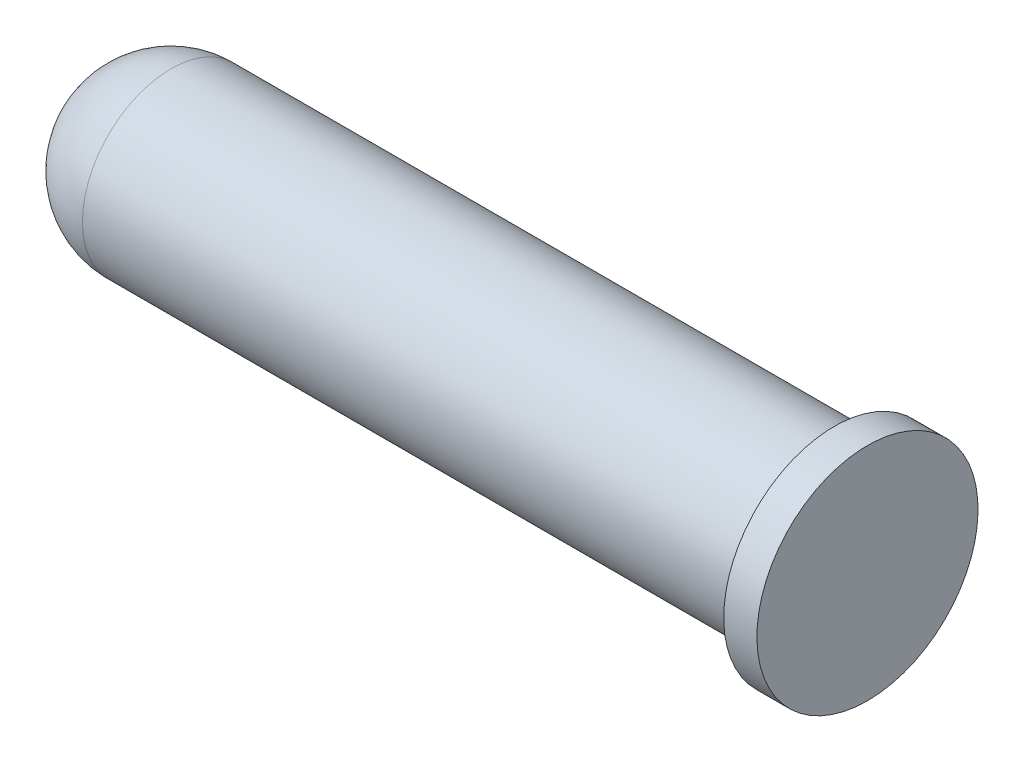
ISO-10303-21;
HEADER;
FILE_DESCRIPTION(('STEP AP214'),'2;1');
FILE_NAME('part.step','',(''),(''),'','','');
FILE_SCHEMA(('AUTOMOTIVE_DESIGN { 1 0 10303 214 1 1 1 1 }'));
ENDSEC;
DATA;
#1=APPLICATION_CONTEXT('core data for automotive mechanical design processes');
#2=APPLICATION_PROTOCOL_DEFINITION('international standard','automotive_design',2000,#1);
#3=PRODUCT_CONTEXT('',#1,'mechanical');
#4=PRODUCT('Part','Part','',(#3));
#5=PRODUCT_RELATED_PRODUCT_CATEGORY('part','',(#4));
#6=PRODUCT_DEFINITION_FORMATION('','',#4);
#7=PRODUCT_DEFINITION_CONTEXT('part definition',#1,'design');
#8=PRODUCT_DEFINITION('design','',#6,#7);
#9=PRODUCT_DEFINITION_SHAPE('','',#8);
#10=(LENGTH_UNIT() NAMED_UNIT(*) SI_UNIT(.MILLI.,.METRE.));
#11=(NAMED_UNIT(*) PLANE_ANGLE_UNIT() SI_UNIT($,.RADIAN.));
#12=(NAMED_UNIT(*) SI_UNIT($,.STERADIAN.) SOLID_ANGLE_UNIT());
#13=UNCERTAINTY_MEASURE_WITH_UNIT(LENGTH_MEASURE(1.E-05),#10,'distance_accuracy_value','');
#14=(GEOMETRIC_REPRESENTATION_CONTEXT(3) GLOBAL_UNCERTAINTY_ASSIGNED_CONTEXT((#13)) GLOBAL_UNIT_ASSIGNED_CONTEXT((#10,
#11,#12)) REPRESENTATION_CONTEXT('',''));
#15=CARTESIAN_POINT('',(0.,0.,0.));
#16=DIRECTION('',(0.,0.,1.));
#17=DIRECTION('',(1.,0.,0.));
#18=AXIS2_PLACEMENT_3D('',#15,#16,#17);
#19=CARTESIAN_POINT('',(-50.5978395387062,-4.85563908799405,0.));
#20=DIRECTION('',(-1.,0.,0.));
#21=DIRECTION('',(0.,1.,0.));
#22=AXIS2_PLACEMENT_3D('',#19,#20,#21);
#23=SPHERICAL_SURFACE('',#22,80.);
#24=CARTESIAN_POINT('',(-50.5978395387062,-4.85563908799405,0.));
#25=DIRECTION('',(-1.,0.,0.));
#26=DIRECTION('',(0.,-1.,0.));
#27=AXIS2_PLACEMENT_3D('',#24,#25,#26);
#28=CIRCLE('',#27,79.9999999999999);
#29=CARTESIAN_POINT('',(-50.5978395387062,-84.855639087994,0.));
#30=VERTEX_POINT('',#29);
#31=EDGE_CURVE('E45',#30,#30,#28,.T.);
#32=ORIENTED_EDGE('',*,*,#31,.T.);
#33=EDGE_LOOP('',(#32));
#34=FACE_BOUND('',#33,.T.);
#35=ADVANCED_FACE('F31',(#34),#23,.T.);
#36=CARTESIAN_POINT('',(579.402160461294,65.1443609120059,0.));
#37=DIRECTION('',(-1.,0.,0.));
#38=DIRECTION('',(0.,-1.,0.));
#39=AXIS2_PLACEMENT_3D('',#36,#37,#38);
#40=PLANE('',#39);
#41=CARTESIAN_POINT('',(579.402160461294,-4.85563908799411,0.));
#42=DIRECTION('',(-1.,0.,0.));
#43=DIRECTION('',(0.,-1.,0.));
#44=AXIS2_PLACEMENT_3D('',#41,#42,#43);
#45=CIRCLE('',#44,100.);
#46=CARTESIAN_POINT('',(579.402160461294,-104.855639087994,0.));
#47=VERTEX_POINT('',#46);
#48=EDGE_CURVE('E10',#47,#47,#45,.T.);
#49=ORIENTED_EDGE('',*,*,#48,.F.);
#50=EDGE_LOOP('',(#49));
#51=FACE_BOUND('',#50,.T.);
#52=ADVANCED_FACE('F65',(#51),#40,.F.);
#53=CARTESIAN_POINT('',(-50.5978395387062,-4.85563908799405,0.));
#54=DIRECTION('',(-1.,0.,0.));
#55=DIRECTION('',(0.,-1.,0.));
#56=AXIS2_PLACEMENT_3D('',#53,#54,#55);
#57=CYLINDRICAL_SURFACE('',#56,100.);
#58=CARTESIAN_POINT('',(549.402160461294,-4.8556390879941,0.));
#59=DIRECTION('',(-1.,0.,0.));
#60=DIRECTION('',(0.,-1.,0.));
#61=AXIS2_PLACEMENT_3D('',#58,#59,#60);
#62=CIRCLE('',#61,100.);
#63=CARTESIAN_POINT('',(549.402160461294,-104.855639087994,0.));
#64=VERTEX_POINT('',#63);
#65=EDGE_CURVE('E37',#64,#64,#62,.T.);
#66=ORIENTED_EDGE('',*,*,#65,.F.);
#67=EDGE_LOOP('',(#66));
#68=FACE_BOUND('',#67,.T.);
#69=ORIENTED_EDGE('',*,*,#48,.T.);
#70=EDGE_LOOP('',(#69));
#71=FACE_BOUND('',#70,.T.);
#72=ADVANCED_FACE('F60',(#68,#71),#57,.T.);
#73=CARTESIAN_POINT('',(549.402160461294,95.1443609120059,0.));
#74=DIRECTION('',(1.,0.,0.));
#75=DIRECTION('',(0.,1.,0.));
#76=AXIS2_PLACEMENT_3D('',#73,#74,#75);
#77=PLANE('',#76);
#78=CARTESIAN_POINT('',(549.402160461294,-4.8556390879941,0.));
#79=DIRECTION('',(-1.,0.,0.));
#80=DIRECTION('',(0.,-1.,0.));
#81=AXIS2_PLACEMENT_3D('',#78,#79,#80);
#82=CIRCLE('',#81,80.);
#83=CARTESIAN_POINT('',(549.402160461294,-84.8556390879941,0.));
#84=VERTEX_POINT('',#83);
#85=EDGE_CURVE('E41',#84,#84,#82,.T.);
#86=ORIENTED_EDGE('',*,*,#85,.F.);
#87=EDGE_LOOP('',(#86));
#88=FACE_BOUND('',#87,.T.);
#89=ORIENTED_EDGE('',*,*,#65,.T.);
#90=EDGE_LOOP('',(#89));
#91=FACE_BOUND('',#90,.T.);
#92=ADVANCED_FACE('F55',(#88,#91),#77,.F.);
#93=CARTESIAN_POINT('',(-50.5978395387062,-4.85563908799405,0.));
#94=DIRECTION('',(-1.,0.,0.));
#95=DIRECTION('',(0.,-1.,0.));
#96=AXIS2_PLACEMENT_3D('',#93,#94,#95);
#97=CYLINDRICAL_SURFACE('',#96,80.);
#98=ORIENTED_EDGE('',*,*,#31,.F.);
#99=EDGE_LOOP('',(#98));
#100=FACE_BOUND('',#99,.T.);
#101=ORIENTED_EDGE('',*,*,#85,.T.);
#102=EDGE_LOOP('',(#101));
#103=FACE_BOUND('',#102,.T.);
#104=ADVANCED_FACE('F52',(#100,#103),#97,.T.);
#105=CLOSED_SHELL('',(#35,#52,#72,#92,#104));
#106=MANIFOLD_SOLID_BREP('B2',#105);
#107=ADVANCED_BREP_SHAPE_REPRESENTATION('',(#18,#106),#14);
#108=SHAPE_DEFINITION_REPRESENTATION(#9,#107);
ENDSEC;
END-ISO-10303-21;
